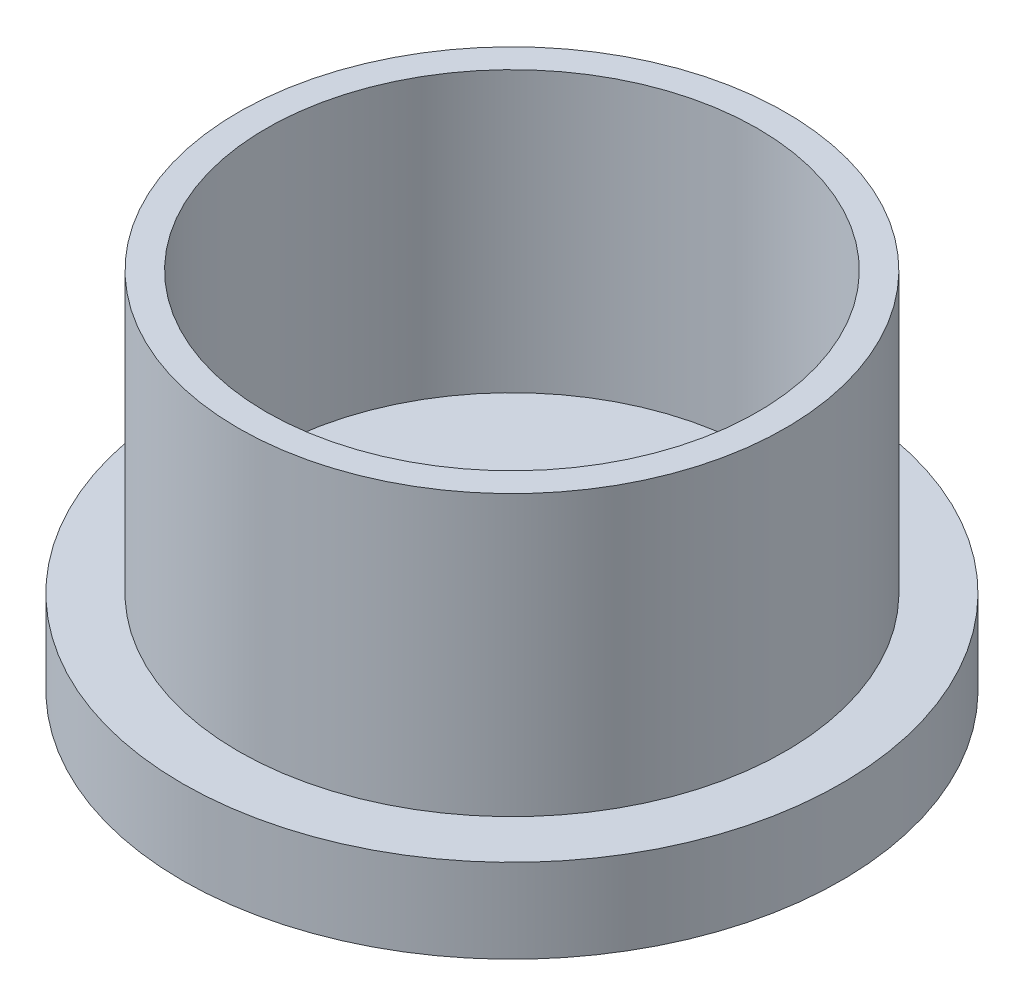
ISO-10303-21;
HEADER;
FILE_DESCRIPTION(('STEP AP214'),'2;1');
FILE_NAME('part.step','',(''),(''),'','','');
FILE_SCHEMA(('AUTOMOTIVE_DESIGN { 1 0 10303 214 1 1 1 1 }'));
ENDSEC;
DATA;
#1=APPLICATION_CONTEXT('core data for automotive mechanical design processes');
#2=APPLICATION_PROTOCOL_DEFINITION('international standard','automotive_design',2000,#1);
#3=PRODUCT_CONTEXT('',#1,'mechanical');
#4=PRODUCT('Part','Part','',(#3));
#5=PRODUCT_RELATED_PRODUCT_CATEGORY('part','',(#4));
#6=PRODUCT_DEFINITION_FORMATION('','',#4);
#7=PRODUCT_DEFINITION_CONTEXT('part definition',#1,'design');
#8=PRODUCT_DEFINITION('design','',#6,#7);
#9=PRODUCT_DEFINITION_SHAPE('','',#8);
#10=(LENGTH_UNIT() NAMED_UNIT(*) SI_UNIT(.MILLI.,.METRE.));
#11=(NAMED_UNIT(*) PLANE_ANGLE_UNIT() SI_UNIT($,.RADIAN.));
#12=(NAMED_UNIT(*) SI_UNIT($,.STERADIAN.) SOLID_ANGLE_UNIT());
#13=UNCERTAINTY_MEASURE_WITH_UNIT(LENGTH_MEASURE(1.E-05),#10,'distance_accuracy_value','');
#14=(GEOMETRIC_REPRESENTATION_CONTEXT(3) GLOBAL_UNCERTAINTY_ASSIGNED_CONTEXT((#13)) GLOBAL_UNIT_ASSIGNED_CONTEXT((#10,
#11,#12)) REPRESENTATION_CONTEXT('',''));
#15=CARTESIAN_POINT('',(0.,0.,0.));
#16=DIRECTION('',(0.,0.,1.));
#17=DIRECTION('',(1.,0.,0.));
#18=AXIS2_PLACEMENT_3D('',#15,#16,#17);
#19=CARTESIAN_POINT('',(-7.78,0.,-0.75));
#20=DIRECTION('',(0.,0.,1.));
#21=DIRECTION('',(1.,0.,0.));
#22=AXIS2_PLACEMENT_3D('',#19,#20,#21);
#23=PLANE('',#22);
#24=DIRECTION('',(0.,1.,0.));
#25=VECTOR('',#24,1.);
#26=CARTESIAN_POINT('',(0.750000000000002,0.,-0.75));
#27=LINE('',#26,#25);
#28=CARTESIAN_POINT('',(0.75,0.,-0.75));
#29=VERTEX_POINT('',#28);
#30=CARTESIAN_POINT('',(0.75,3.,-0.75));
#31=VERTEX_POINT('',#30);
#32=EDGE_CURVE('E142',#29,#31,#27,.T.);
#33=ORIENTED_EDGE('',*,*,#32,.F.);
#34=DIRECTION('',(1.,0.,0.));
#35=VECTOR('',#34,1.);
#36=CARTESIAN_POINT('',(-7.78,0.,-0.75));
#37=LINE('',#36,#35);
#38=CARTESIAN_POINT('',(7.78,0.,-0.75));
#39=VERTEX_POINT('',#38);
#40=EDGE_CURVE('E175',#29,#39,#37,.T.);
#41=ORIENTED_EDGE('',*,*,#40,.T.);
#42=DIRECTION('',(0.,1.,0.));
#43=VECTOR('',#42,1.);
#44=CARTESIAN_POINT('',(7.78,0.,-0.75));
#45=LINE('',#44,#43);
#46=CARTESIAN_POINT('',(7.78,3.,-0.75));
#47=VERTEX_POINT('',#46);
#48=EDGE_CURVE('E194',#39,#47,#45,.T.);
#49=ORIENTED_EDGE('',*,*,#48,.T.);
#50=DIRECTION('',(1.,0.,0.));
#51=VECTOR('',#50,1.);
#52=CARTESIAN_POINT('',(-7.78,3.,-0.75));
#53=LINE('',#52,#51);
#54=EDGE_CURVE('E188',#31,#47,#53,.T.);
#55=ORIENTED_EDGE('',*,*,#54,.F.);
#56=EDGE_LOOP('',(#33,#41,#49,#55));
#57=FACE_BOUND('',#56,.T.);
#58=ADVANCED_FACE('F33',(#57),#23,.T.);
#59=CARTESIAN_POINT('',(-7.78,0.,0.75));
#60=DIRECTION('',(0.,0.,1.));
#61=DIRECTION('',(1.,0.,0.));
#62=AXIS2_PLACEMENT_3D('',#59,#60,#61);
#63=PLANE('',#62);
#64=DIRECTION('',(1.,0.,0.));
#65=VECTOR('',#64,1.);
#66=CARTESIAN_POINT('',(-7.78,0.,0.75));
#67=LINE('',#66,#65);
#68=CARTESIAN_POINT('',(0.75,0.,0.75));
#69=VERTEX_POINT('',#68);
#70=CARTESIAN_POINT('',(7.78,0.,0.75));
#71=VERTEX_POINT('',#70);
#72=EDGE_CURVE('E56',#69,#71,#67,.T.);
#73=ORIENTED_EDGE('',*,*,#72,.F.);
#74=DIRECTION('',(0.,1.,0.));
#75=VECTOR('',#74,1.);
#76=CARTESIAN_POINT('',(0.750000000000002,0.,0.75));
#77=LINE('',#76,#75);
#78=CARTESIAN_POINT('',(0.750000000000002,3.,0.75));
#79=VERTEX_POINT('',#78);
#80=EDGE_CURVE('E11',#69,#79,#77,.T.);
#81=ORIENTED_EDGE('',*,*,#80,.T.);
#82=DIRECTION('',(1.,0.,0.));
#83=VECTOR('',#82,1.);
#84=CARTESIAN_POINT('',(-7.78,3.,0.75));
#85=LINE('',#84,#83);
#86=CARTESIAN_POINT('',(7.78,3.,0.75));
#87=VERTEX_POINT('',#86);
#88=EDGE_CURVE('E182',#79,#87,#85,.T.);
#89=ORIENTED_EDGE('',*,*,#88,.T.);
#90=DIRECTION('',(0.,1.,0.));
#91=VECTOR('',#90,1.);
#92=CARTESIAN_POINT('',(7.78,0.,0.75));
#93=LINE('',#92,#91);
#94=EDGE_CURVE('E197',#71,#87,#93,.T.);
#95=ORIENTED_EDGE('',*,*,#94,.F.);
#96=EDGE_LOOP('',(#73,#81,#89,#95));
#97=FACE_BOUND('',#96,.T.);
#98=ADVANCED_FACE('F245',(#97),#63,.F.);
#99=CARTESIAN_POINT('',(0.,3.,0.));
#100=DIRECTION('',(0.,-1.,0.));
#101=DIRECTION('',(0.,0.,-1.));
#102=AXIS2_PLACEMENT_3D('',#99,#100,#101);
#103=CYLINDRICAL_SURFACE('',#102,11.78);
#104=CARTESIAN_POINT('',(0.,3.,0.));
#105=DIRECTION('',(0.,1.,0.));
#106=DIRECTION('',(0.,0.,1.));
#107=AXIS2_PLACEMENT_3D('',#104,#105,#106);
#108=CIRCLE('',#107,11.78);
#109=CARTESIAN_POINT('',(0.,3.,11.78));
#110=VERTEX_POINT('',#109);
#111=EDGE_CURVE('E202',#110,#110,#108,.T.);
#112=ORIENTED_EDGE('',*,*,#111,.F.);
#113=EDGE_LOOP('',(#112));
#114=FACE_BOUND('',#113,.T.);
#115=CARTESIAN_POINT('',(0.,0.,0.));
#116=DIRECTION('',(0.,1.,0.));
#117=DIRECTION('',(0.,0.,1.));
#118=AXIS2_PLACEMENT_3D('',#115,#116,#117);
#119=CIRCLE('',#118,11.78);
#120=CARTESIAN_POINT('',(0.,0.,11.78));
#121=VERTEX_POINT('',#120);
#122=EDGE_CURVE('E193',#121,#121,#119,.T.);
#123=ORIENTED_EDGE('',*,*,#122,.T.);
#124=EDGE_LOOP('',(#123));
#125=FACE_BOUND('',#124,.T.);
#126=ADVANCED_FACE('F35',(#114,#125),#103,.T.);
#127=CARTESIAN_POINT('',(0.,3.,0.));
#128=DIRECTION('',(0.,1.,0.));
#129=DIRECTION('',(0.,0.,1.));
#130=AXIS2_PLACEMENT_3D('',#127,#128,#129);
#131=PLANE('',#130);
#132=CARTESIAN_POINT('',(0.,3.,0.));
#133=DIRECTION('',(0.,1.,0.));
#134=DIRECTION('',(0.,0.,1.));
#135=AXIS2_PLACEMENT_3D('',#132,#133,#134);
#136=CIRCLE('',#135,9.78);
#137=CARTESIAN_POINT('',(0.,3.,9.78));
#138=VERTEX_POINT('',#137);
#139=EDGE_CURVE('E277',#138,#138,#136,.T.);
#140=ORIENTED_EDGE('',*,*,#139,.F.);
#141=EDGE_LOOP('',(#140));
#142=FACE_BOUND('',#141,.T.);
#143=ORIENTED_EDGE('',*,*,#111,.T.);
#144=EDGE_LOOP('',(#143));
#145=FACE_BOUND('',#144,.T.);
#146=ADVANCED_FACE('F308',(#142,#145),#131,.T.);
#147=CARTESIAN_POINT('',(0.,0.,0.));
#148=DIRECTION('',(0.,1.,0.));
#149=DIRECTION('',(0.,0.,1.));
#150=AXIS2_PLACEMENT_3D('',#147,#148,#149);
#151=PLANE('',#150);
#152=DIRECTION('',(1.,0.,0.));
#153=VECTOR('',#152,1.);
#154=CARTESIAN_POINT('',(-0.749999999999999,0.,7.78));
#155=LINE('',#154,#153);
#156=CARTESIAN_POINT('',(-0.749999999999999,0.,7.78));
#157=VERTEX_POINT('',#156);
#158=CARTESIAN_POINT('',(0.750000000000001,0.,7.78));
#159=VERTEX_POINT('',#158);
#160=EDGE_CURVE('E151',#157,#159,#155,.T.);
#161=ORIENTED_EDGE('',*,*,#160,.T.);
#162=DIRECTION('',(0.,0.,-1.));
#163=VECTOR('',#162,1.);
#164=CARTESIAN_POINT('',(0.749999999999999,0.,-7.78));
#165=LINE('',#164,#163);
#166=EDGE_CURVE('E275',#159,#69,#165,.T.);
#167=ORIENTED_EDGE('',*,*,#166,.T.);
#168=ORIENTED_EDGE('',*,*,#72,.T.);
#169=DIRECTION('',(0.,0.,1.));
#170=VECTOR('',#169,1.);
#171=CARTESIAN_POINT('',(7.78,0.,-0.75));
#172=LINE('',#171,#170);
#173=EDGE_CURVE('E172',#39,#71,#172,.T.);
#174=ORIENTED_EDGE('',*,*,#173,.F.);
#175=ORIENTED_EDGE('',*,*,#40,.F.);
#176=CARTESIAN_POINT('',(0.749999999999999,0.,-7.78));
#177=VERTEX_POINT('',#176);
#178=EDGE_CURVE('E224',#29,#177,#165,.T.);
#179=ORIENTED_EDGE('',*,*,#178,.T.);
#180=DIRECTION('',(-1.,0.,0.));
#181=VECTOR('',#180,1.);
#182=CARTESIAN_POINT('',(-0.750000000000001,0.,-7.78));
#183=LINE('',#182,#181);
#184=CARTESIAN_POINT('',(-0.750000000000001,0.,-7.78));
#185=VERTEX_POINT('',#184);
#186=EDGE_CURVE('E148',#177,#185,#183,.T.);
#187=ORIENTED_EDGE('',*,*,#186,.T.);
#188=DIRECTION('',(0.,0.,1.));
#189=VECTOR('',#188,1.);
#190=CARTESIAN_POINT('',(-0.750000000000001,0.,-7.78));
#191=LINE('',#190,#189);
#192=CARTESIAN_POINT('',(-0.75,0.,-0.75));
#193=VERTEX_POINT('',#192);
#194=EDGE_CURVE('E156',#185,#193,#191,.T.);
#195=ORIENTED_EDGE('',*,*,#194,.T.);
#196=CARTESIAN_POINT('',(-7.78,0.,-0.75));
#197=VERTEX_POINT('',#196);
#198=EDGE_CURVE('E176',#197,#193,#37,.T.);
#199=ORIENTED_EDGE('',*,*,#198,.F.);
#200=DIRECTION('',(0.,0.,1.));
#201=VECTOR('',#200,1.);
#202=CARTESIAN_POINT('',(-7.78,0.,-0.75));
#203=LINE('',#202,#201);
#204=CARTESIAN_POINT('',(-7.78,0.,0.75));
#205=VERTEX_POINT('',#204);
#206=EDGE_CURVE('E165',#197,#205,#203,.T.);
#207=ORIENTED_EDGE('',*,*,#206,.T.);
#208=CARTESIAN_POINT('',(-0.750000000000001,0.,0.75));
#209=VERTEX_POINT('',#208);
#210=EDGE_CURVE('E169',#205,#209,#67,.T.);
#211=ORIENTED_EDGE('',*,*,#210,.T.);
#212=EDGE_CURVE('E48',#209,#157,#191,.T.);
#213=ORIENTED_EDGE('',*,*,#212,.T.);
#214=EDGE_LOOP('',(#161,#167,#168,#174,#175,#179,#187,#195,#199,#207,#211,#213));
#215=FACE_BOUND('',#214,.T.);
#216=ORIENTED_EDGE('',*,*,#122,.F.);
#217=EDGE_LOOP('',(#216));
#218=FACE_BOUND('',#217,.T.);
#219=ADVANCED_FACE('F210',(#215,#218),#151,.F.);
#220=CARTESIAN_POINT('',(-7.78,0.,-0.75));
#221=DIRECTION('',(-1.,0.,0.));
#222=DIRECTION('',(0.,0.,1.));
#223=AXIS2_PLACEMENT_3D('',#220,#221,#222);
#224=PLANE('',#223);
#225=DIRECTION('',(0.,0.,1.));
#226=VECTOR('',#225,1.);
#227=CARTESIAN_POINT('',(-7.78,3.,-0.75));
#228=LINE('',#227,#226);
#229=CARTESIAN_POINT('',(-7.78,3.,-0.75));
#230=VERTEX_POINT('',#229);
#231=CARTESIAN_POINT('',(-7.78,3.,0.75));
#232=VERTEX_POINT('',#231);
#233=EDGE_CURVE('E164',#230,#232,#228,.T.);
#234=ORIENTED_EDGE('',*,*,#233,.T.);
#235=DIRECTION('',(0.,1.,0.));
#236=VECTOR('',#235,1.);
#237=CARTESIAN_POINT('',(-7.78,0.,0.75));
#238=LINE('',#237,#236);
#239=EDGE_CURVE('E179',#205,#232,#238,.T.);
#240=ORIENTED_EDGE('',*,*,#239,.F.);
#241=ORIENTED_EDGE('',*,*,#206,.F.);
#242=DIRECTION('',(0.,1.,0.));
#243=VECTOR('',#242,1.);
#244=CARTESIAN_POINT('',(-7.78,0.,-0.75));
#245=LINE('',#244,#243);
#246=EDGE_CURVE('E190',#197,#230,#245,.T.);
#247=ORIENTED_EDGE('',*,*,#246,.T.);
#248=EDGE_LOOP('',(#234,#240,#241,#247));
#249=FACE_BOUND('',#248,.T.);
#250=ADVANCED_FACE('F216',(#249),#224,.F.);
#251=DIRECTION('',(0.,-1.,0.));
#252=VECTOR('',#251,1.);
#253=CARTESIAN_POINT('',(-0.75,0.,-0.75));
#254=LINE('',#253,#252);
#255=CARTESIAN_POINT('',(-0.75,3.,-0.75));
#256=VERTEX_POINT('',#255);
#257=EDGE_CURVE('E160',#256,#193,#254,.T.);
#258=ORIENTED_EDGE('',*,*,#257,.F.);
#259=EDGE_CURVE('E168',#230,#256,#53,.T.);
#260=ORIENTED_EDGE('',*,*,#259,.F.);
#261=ORIENTED_EDGE('',*,*,#246,.F.);
#262=ORIENTED_EDGE('',*,*,#198,.T.);
#263=EDGE_LOOP('',(#258,#260,#261,#262));
#264=FACE_BOUND('',#263,.T.);
#265=ADVANCED_FACE('F248',(#264),#23,.T.);
#266=CARTESIAN_POINT('',(7.78,0.,-0.75));
#267=DIRECTION('',(-1.,0.,0.));
#268=DIRECTION('',(0.,0.,1.));
#269=AXIS2_PLACEMENT_3D('',#266,#267,#268);
#270=PLANE('',#269);
#271=DIRECTION('',(0.,0.,1.));
#272=VECTOR('',#271,1.);
#273=CARTESIAN_POINT('',(7.78,3.,-0.75));
#274=LINE('',#273,#272);
#275=EDGE_CURVE('E186',#47,#87,#274,.T.);
#276=ORIENTED_EDGE('',*,*,#275,.F.);
#277=ORIENTED_EDGE('',*,*,#48,.F.);
#278=ORIENTED_EDGE('',*,*,#173,.T.);
#279=ORIENTED_EDGE('',*,*,#94,.T.);
#280=EDGE_LOOP('',(#276,#277,#278,#279));
#281=FACE_BOUND('',#280,.T.);
#282=ADVANCED_FACE('F256',(#281),#270,.T.);
#283=CARTESIAN_POINT('',(-0.750000000000001,3.,0.75));
#284=VERTEX_POINT('',#283);
#285=EDGE_CURVE('E183',#232,#284,#85,.T.);
#286=ORIENTED_EDGE('',*,*,#285,.T.);
#287=DIRECTION('',(0.,-1.,0.));
#288=VECTOR('',#287,1.);
#289=CARTESIAN_POINT('',(-0.75,0.,0.75));
#290=LINE('',#289,#288);
#291=EDGE_CURVE('E41',#284,#209,#290,.T.);
#292=ORIENTED_EDGE('',*,*,#291,.T.);
#293=ORIENTED_EDGE('',*,*,#210,.F.);
#294=ORIENTED_EDGE('',*,*,#239,.T.);
#295=EDGE_LOOP('',(#286,#292,#293,#294));
#296=FACE_BOUND('',#295,.T.);
#297=ADVANCED_FACE('F208',(#296),#63,.F.);
#298=CARTESIAN_POINT('',(0.749999999999999,0.,-7.78));
#299=DIRECTION('',(1.,0.,0.));
#300=DIRECTION('',(0.,0.,-1.));
#301=AXIS2_PLACEMENT_3D('',#298,#299,#300);
#302=PLANE('',#301);
#303=ORIENTED_EDGE('',*,*,#166,.F.);
#304=DIRECTION('',(0.,1.,0.));
#305=VECTOR('',#304,1.);
#306=CARTESIAN_POINT('',(0.750000000000001,0.,7.78));
#307=LINE('',#306,#305);
#308=CARTESIAN_POINT('',(0.750000000000001,3.,7.78));
#309=VERTEX_POINT('',#308);
#310=EDGE_CURVE('E162',#159,#309,#307,.T.);
#311=ORIENTED_EDGE('',*,*,#310,.T.);
#312=DIRECTION('',(0.,0.,-1.));
#313=VECTOR('',#312,1.);
#314=CARTESIAN_POINT('',(0.749999999999999,3.,-7.78));
#315=LINE('',#314,#313);
#316=EDGE_CURVE('E135',#309,#79,#315,.T.);
#317=ORIENTED_EDGE('',*,*,#316,.T.);
#318=ORIENTED_EDGE('',*,*,#80,.F.);
#319=EDGE_LOOP('',(#303,#311,#317,#318));
#320=FACE_BOUND('',#319,.T.);
#321=ADVANCED_FACE('F231',(#320),#302,.F.);
#322=CARTESIAN_POINT('',(-0.750000000000001,0.,-7.78));
#323=DIRECTION('',(-1.,0.,0.));
#324=DIRECTION('',(0.,0.,1.));
#325=AXIS2_PLACEMENT_3D('',#322,#323,#324);
#326=PLANE('',#325);
#327=DIRECTION('',(0.,0.,1.));
#328=VECTOR('',#327,1.);
#329=CARTESIAN_POINT('',(-0.750000000000001,3.,-7.78));
#330=LINE('',#329,#328);
#331=CARTESIAN_POINT('',(-0.749999999999999,3.,7.78));
#332=VERTEX_POINT('',#331);
#333=EDGE_CURVE('E134',#284,#332,#330,.T.);
#334=ORIENTED_EDGE('',*,*,#333,.T.);
#335=DIRECTION('',(0.,1.,0.));
#336=VECTOR('',#335,1.);
#337=CARTESIAN_POINT('',(-0.749999999999999,0.,7.78));
#338=LINE('',#337,#336);
#339=EDGE_CURVE('E153',#157,#332,#338,.T.);
#340=ORIENTED_EDGE('',*,*,#339,.F.);
#341=ORIENTED_EDGE('',*,*,#212,.F.);
#342=ORIENTED_EDGE('',*,*,#291,.F.);
#343=EDGE_LOOP('',(#334,#340,#341,#342));
#344=FACE_BOUND('',#343,.T.);
#345=ADVANCED_FACE('F229',(#344),#326,.F.);
#346=CARTESIAN_POINT('',(-0.749999999999999,0.,7.78));
#347=DIRECTION('',(0.,0.,1.));
#348=DIRECTION('',(1.,0.,0.));
#349=AXIS2_PLACEMENT_3D('',#346,#347,#348);
#350=PLANE('',#349);
#351=DIRECTION('',(1.,0.,0.));
#352=VECTOR('',#351,1.);
#353=CARTESIAN_POINT('',(-0.749999999999999,3.,7.78));
#354=LINE('',#353,#352);
#355=EDGE_CURVE('E219',#332,#309,#354,.T.);
#356=ORIENTED_EDGE('',*,*,#355,.T.);
#357=ORIENTED_EDGE('',*,*,#310,.F.);
#358=ORIENTED_EDGE('',*,*,#160,.F.);
#359=ORIENTED_EDGE('',*,*,#339,.T.);
#360=EDGE_LOOP('',(#356,#357,#358,#359));
#361=FACE_BOUND('',#360,.T.);
#362=ADVANCED_FACE('F228',(#361),#350,.F.);
#363=ORIENTED_EDGE('',*,*,#32,.T.);
#364=CARTESIAN_POINT('',(0.749999999999999,3.,-7.78));
#365=VERTEX_POINT('',#364);
#366=EDGE_CURVE('E127',#31,#365,#315,.T.);
#367=ORIENTED_EDGE('',*,*,#366,.T.);
#368=DIRECTION('',(0.,1.,0.));
#369=VECTOR('',#368,1.);
#370=CARTESIAN_POINT('',(0.749999999999999,0.,-7.78));
#371=LINE('',#370,#369);
#372=EDGE_CURVE('E139',#177,#365,#371,.T.);
#373=ORIENTED_EDGE('',*,*,#372,.F.);
#374=ORIENTED_EDGE('',*,*,#178,.F.);
#375=EDGE_LOOP('',(#363,#367,#373,#374));
#376=FACE_BOUND('',#375,.T.);
#377=ADVANCED_FACE('F138',(#376),#302,.F.);
#378=ORIENTED_EDGE('',*,*,#257,.T.);
#379=ORIENTED_EDGE('',*,*,#194,.F.);
#380=DIRECTION('',(0.,1.,0.));
#381=VECTOR('',#380,1.);
#382=CARTESIAN_POINT('',(-0.750000000000001,0.,-7.78));
#383=LINE('',#382,#381);
#384=CARTESIAN_POINT('',(-0.750000000000001,3.,-7.78));
#385=VERTEX_POINT('',#384);
#386=EDGE_CURVE('E150',#185,#385,#383,.T.);
#387=ORIENTED_EDGE('',*,*,#386,.T.);
#388=EDGE_CURVE('E130',#385,#256,#330,.T.);
#389=ORIENTED_EDGE('',*,*,#388,.T.);
#390=EDGE_LOOP('',(#378,#379,#387,#389));
#391=FACE_BOUND('',#390,.T.);
#392=ADVANCED_FACE('F233',(#391),#326,.F.);
#393=CARTESIAN_POINT('',(-0.750000000000001,0.,-7.78));
#394=DIRECTION('',(0.,0.,-1.));
#395=DIRECTION('',(-1.,0.,0.));
#396=AXIS2_PLACEMENT_3D('',#393,#394,#395);
#397=PLANE('',#396);
#398=DIRECTION('',(-1.,0.,0.));
#399=VECTOR('',#398,1.);
#400=CARTESIAN_POINT('',(-0.750000000000001,3.,-7.78));
#401=LINE('',#400,#399);
#402=EDGE_CURVE('E124',#365,#385,#401,.T.);
#403=ORIENTED_EDGE('',*,*,#402,.T.);
#404=ORIENTED_EDGE('',*,*,#386,.F.);
#405=ORIENTED_EDGE('',*,*,#186,.F.);
#406=ORIENTED_EDGE('',*,*,#372,.T.);
#407=EDGE_LOOP('',(#403,#404,#405,#406));
#408=FACE_BOUND('',#407,.T.);
#409=ADVANCED_FACE('F146',(#408),#397,.F.);
#410=CARTESIAN_POINT('',(0.,13.,0.));
#411=DIRECTION('',(0.,-1.,0.));
#412=DIRECTION('',(0.,0.,-1.));
#413=AXIS2_PLACEMENT_3D('',#410,#411,#412);
#414=CYLINDRICAL_SURFACE('',#413,9.78);
#415=CARTESIAN_POINT('',(0.,13.,0.));
#416=DIRECTION('',(0.,1.,0.));
#417=DIRECTION('',(0.,0.,1.));
#418=AXIS2_PLACEMENT_3D('',#415,#416,#417);
#419=CIRCLE('',#418,9.78);
#420=CARTESIAN_POINT('',(0.,13.,9.78));
#421=VERTEX_POINT('',#420);
#422=EDGE_CURVE('E144',#421,#421,#419,.T.);
#423=ORIENTED_EDGE('',*,*,#422,.F.);
#424=EDGE_LOOP('',(#423));
#425=FACE_BOUND('',#424,.T.);
#426=ORIENTED_EDGE('',*,*,#139,.T.);
#427=EDGE_LOOP('',(#426));
#428=FACE_BOUND('',#427,.T.);
#429=ADVANCED_FACE('F299',(#425,#428),#414,.T.);
#430=CARTESIAN_POINT('',(0.,13.,0.));
#431=DIRECTION('',(0.,1.,0.));
#432=DIRECTION('',(0.,0.,1.));
#433=AXIS2_PLACEMENT_3D('',#430,#431,#432);
#434=PLANE('',#433);
#435=CARTESIAN_POINT('',(0.,13.,0.));
#436=DIRECTION('',(0.,1.,0.));
#437=DIRECTION('',(0.,0.,1.));
#438=AXIS2_PLACEMENT_3D('',#435,#436,#437);
#439=CIRCLE('',#438,8.78);
#440=CARTESIAN_POINT('',(0.,13.,8.78));
#441=VERTEX_POINT('',#440);
#442=EDGE_CURVE('E283',#441,#441,#439,.T.);
#443=ORIENTED_EDGE('',*,*,#442,.F.);
#444=EDGE_LOOP('',(#443));
#445=FACE_BOUND('',#444,.T.);
#446=ORIENTED_EDGE('',*,*,#422,.T.);
#447=EDGE_LOOP('',(#446));
#448=FACE_BOUND('',#447,.T.);
#449=ADVANCED_FACE('F296',(#445,#448),#434,.T.);
#450=CARTESIAN_POINT('',(0.,3.,0.));
#451=DIRECTION('',(0.,1.,0.));
#452=DIRECTION('',(0.,0.,1.));
#453=AXIS2_PLACEMENT_3D('',#450,#451,#452);
#454=PLANE('',#453);
#455=CARTESIAN_POINT('',(0.,3.,0.));
#456=DIRECTION('',(0.,1.,0.));
#457=DIRECTION('',(0.,0.,1.));
#458=AXIS2_PLACEMENT_3D('',#455,#456,#457);
#459=CIRCLE('',#458,8.78);
#460=CARTESIAN_POINT('',(0.,3.,8.78));
#461=VERTEX_POINT('',#460);
#462=EDGE_CURVE('E280',#461,#461,#459,.T.);
#463=ORIENTED_EDGE('',*,*,#462,.T.);
#464=EDGE_LOOP('',(#463));
#465=FACE_BOUND('',#464,.T.);
#466=ORIENTED_EDGE('',*,*,#355,.F.);
#467=ORIENTED_EDGE('',*,*,#333,.F.);
#468=ORIENTED_EDGE('',*,*,#285,.F.);
#469=ORIENTED_EDGE('',*,*,#233,.F.);
#470=ORIENTED_EDGE('',*,*,#259,.T.);
#471=ORIENTED_EDGE('',*,*,#388,.F.);
#472=ORIENTED_EDGE('',*,*,#402,.F.);
#473=ORIENTED_EDGE('',*,*,#366,.F.);
#474=ORIENTED_EDGE('',*,*,#54,.T.);
#475=ORIENTED_EDGE('',*,*,#275,.T.);
#476=ORIENTED_EDGE('',*,*,#88,.F.);
#477=ORIENTED_EDGE('',*,*,#316,.F.);
#478=EDGE_LOOP('',(#466,#467,#468,#469,#470,#471,#472,#473,#474,#475,#476,#477));
#479=FACE_BOUND('',#478,.T.);
#480=ADVANCED_FACE('F126',(#465,#479),#454,.T.);
#481=CARTESIAN_POINT('',(0.,3.,0.));
#482=DIRECTION('',(0.,1.,0.));
#483=DIRECTION('',(0.,0.,1.));
#484=AXIS2_PLACEMENT_3D('',#481,#482,#483);
#485=CYLINDRICAL_SURFACE('',#484,8.78);
#486=ORIENTED_EDGE('',*,*,#462,.F.);
#487=EDGE_LOOP('',(#486));
#488=FACE_BOUND('',#487,.T.);
#489=ORIENTED_EDGE('',*,*,#442,.T.);
#490=EDGE_LOOP('',(#489));
#491=FACE_BOUND('',#490,.T.);
#492=ADVANCED_FACE('F290',(#488,#491),#485,.F.);
#493=CLOSED_SHELL('',(#58,#98,#126,#146,#219,#250,#265,#282,#297,#321,#345,#362,#377,#392,#409,
#429,#449,#480,#492));
#494=MANIFOLD_SOLID_BREP('B2',#493);
#495=ADVANCED_BREP_SHAPE_REPRESENTATION('',(#18,#494),#14);
#496=SHAPE_DEFINITION_REPRESENTATION(#9,#495);
ENDSEC;
END-ISO-10303-21;
